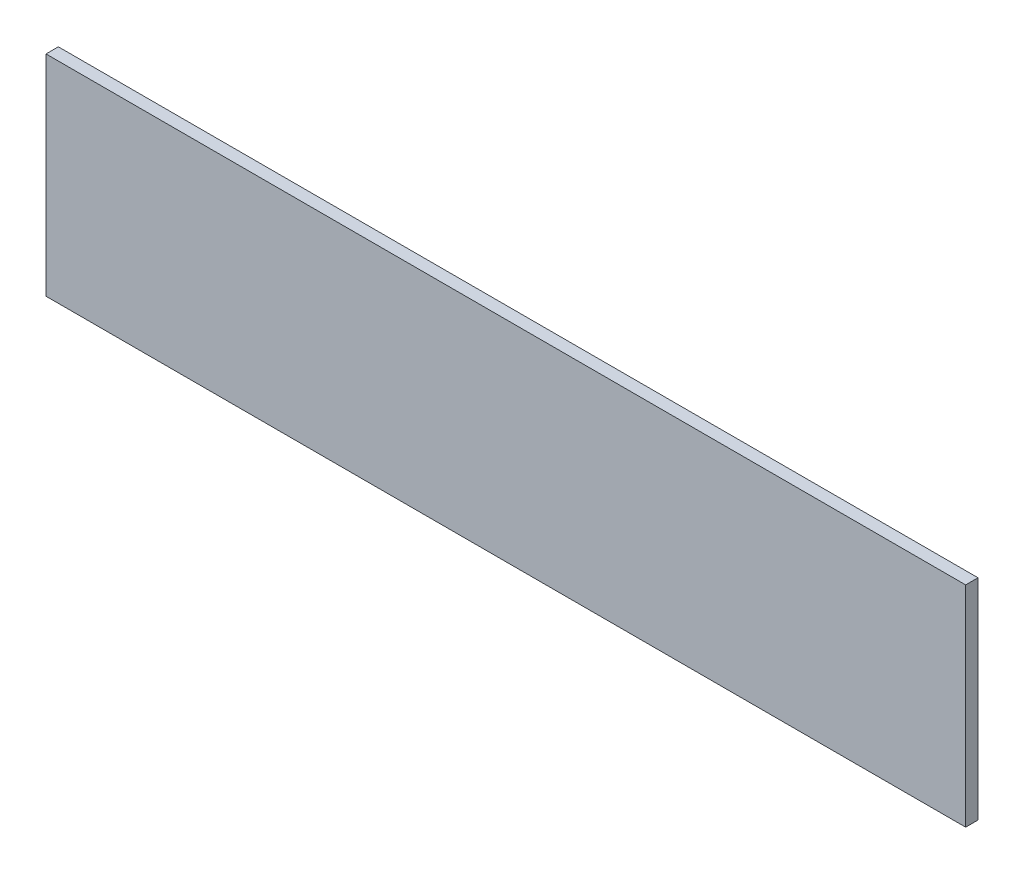
ISO-10303-21;
HEADER;
FILE_DESCRIPTION(('STEP AP214'),'2;1');
FILE_NAME('part.step','',(''),(''),'','','');
FILE_SCHEMA(('AUTOMOTIVE_DESIGN { 1 0 10303 214 1 1 1 1 }'));
ENDSEC;
DATA;
#1=APPLICATION_CONTEXT('core data for automotive mechanical design processes');
#2=APPLICATION_PROTOCOL_DEFINITION('international standard','automotive_design',2000,#1);
#3=PRODUCT_CONTEXT('',#1,'mechanical');
#4=PRODUCT('Part','Part','',(#3));
#5=PRODUCT_RELATED_PRODUCT_CATEGORY('part','',(#4));
#6=PRODUCT_DEFINITION_FORMATION('','',#4);
#7=PRODUCT_DEFINITION_CONTEXT('part definition',#1,'design');
#8=PRODUCT_DEFINITION('design','',#6,#7);
#9=PRODUCT_DEFINITION_SHAPE('','',#8);
#10=(LENGTH_UNIT() NAMED_UNIT(*) SI_UNIT(.MILLI.,.METRE.));
#11=(NAMED_UNIT(*) PLANE_ANGLE_UNIT() SI_UNIT($,.RADIAN.));
#12=(NAMED_UNIT(*) SI_UNIT($,.STERADIAN.) SOLID_ANGLE_UNIT());
#13=UNCERTAINTY_MEASURE_WITH_UNIT(LENGTH_MEASURE(1.E-05),#10,'distance_accuracy_value','');
#14=(GEOMETRIC_REPRESENTATION_CONTEXT(3) GLOBAL_UNCERTAINTY_ASSIGNED_CONTEXT((#13)) GLOBAL_UNIT_ASSIGNED_CONTEXT((#10,
#11,#12)) REPRESENTATION_CONTEXT('',''));
#15=CARTESIAN_POINT('',(0.,0.,0.));
#16=DIRECTION('',(0.,0.,1.));
#17=DIRECTION('',(1.,0.,0.));
#18=AXIS2_PLACEMENT_3D('',#15,#16,#17);
#19=CARTESIAN_POINT('',(74.5,-17.,2.));
#20=DIRECTION('',(-1.,0.,0.));
#21=DIRECTION('',(0.,0.,1.));
#22=AXIS2_PLACEMENT_3D('',#19,#20,#21);
#23=PLANE('',#22);
#24=DIRECTION('',(0.,1.,0.));
#25=VECTOR('',#24,1.);
#26=CARTESIAN_POINT('',(74.5,-17.,0.));
#27=LINE('',#26,#25);
#28=CARTESIAN_POINT('',(74.5,-17.,0.));
#29=VERTEX_POINT('',#28);
#30=CARTESIAN_POINT('',(74.5,17.,0.));
#31=VERTEX_POINT('',#30);
#32=EDGE_CURVE('E96',#29,#31,#27,.T.);
#33=ORIENTED_EDGE('',*,*,#32,.T.);
#34=DIRECTION('',(0.,0.,-1.));
#35=VECTOR('',#34,1.);
#36=CARTESIAN_POINT('',(74.5,17.,2.));
#37=LINE('',#36,#35);
#38=CARTESIAN_POINT('',(74.5,17.,2.));
#39=VERTEX_POINT('',#38);
#40=EDGE_CURVE('E11',#39,#31,#37,.T.);
#41=ORIENTED_EDGE('',*,*,#40,.F.);
#42=DIRECTION('',(0.,1.,0.));
#43=VECTOR('',#42,1.);
#44=CARTESIAN_POINT('',(74.5,-17.,2.));
#45=LINE('',#44,#43);
#46=CARTESIAN_POINT('',(74.5,-17.,2.));
#47=VERTEX_POINT('',#46);
#48=EDGE_CURVE('E84',#47,#39,#45,.T.);
#49=ORIENTED_EDGE('',*,*,#48,.F.);
#50=DIRECTION('',(0.,0.,-1.));
#51=VECTOR('',#50,1.);
#52=CARTESIAN_POINT('',(74.5,-17.,2.));
#53=LINE('',#52,#51);
#54=EDGE_CURVE('E92',#47,#29,#53,.T.);
#55=ORIENTED_EDGE('',*,*,#54,.T.);
#56=EDGE_LOOP('',(#33,#41,#49,#55));
#57=FACE_BOUND('',#56,.T.);
#58=ADVANCED_FACE('F33',(#57),#23,.F.);
#59=CARTESIAN_POINT('',(-74.5,17.,2.));
#60=DIRECTION('',(0.,-1.,0.));
#61=DIRECTION('',(0.,0.,-1.));
#62=AXIS2_PLACEMENT_3D('',#59,#60,#61);
#63=PLANE('',#62);
#64=DIRECTION('',(-1.,0.,0.));
#65=VECTOR('',#64,1.);
#66=CARTESIAN_POINT('',(-74.5,17.,0.));
#67=LINE('',#66,#65);
#68=CARTESIAN_POINT('',(-74.5,17.,0.));
#69=VERTEX_POINT('',#68);
#70=EDGE_CURVE('E88',#31,#69,#67,.T.);
#71=ORIENTED_EDGE('',*,*,#70,.T.);
#72=DIRECTION('',(0.,0.,-1.));
#73=VECTOR('',#72,1.);
#74=CARTESIAN_POINT('',(-74.5,17.,2.));
#75=LINE('',#74,#73);
#76=CARTESIAN_POINT('',(-74.5,17.,2.));
#77=VERTEX_POINT('',#76);
#78=EDGE_CURVE('E41',#77,#69,#75,.T.);
#79=ORIENTED_EDGE('',*,*,#78,.F.);
#80=DIRECTION('',(-1.,0.,0.));
#81=VECTOR('',#80,1.);
#82=CARTESIAN_POINT('',(-74.5,17.,2.));
#83=LINE('',#82,#81);
#84=EDGE_CURVE('E79',#39,#77,#83,.T.);
#85=ORIENTED_EDGE('',*,*,#84,.F.);
#86=ORIENTED_EDGE('',*,*,#40,.T.);
#87=EDGE_LOOP('',(#71,#79,#85,#86));
#88=FACE_BOUND('',#87,.T.);
#89=ADVANCED_FACE('F87',(#88),#63,.F.);
#90=CARTESIAN_POINT('',(-74.5,-17.,2.));
#91=DIRECTION('',(1.,0.,0.));
#92=DIRECTION('',(0.,0.,-1.));
#93=AXIS2_PLACEMENT_3D('',#90,#91,#92);
#94=PLANE('',#93);
#95=DIRECTION('',(0.,-1.,0.));
#96=VECTOR('',#95,1.);
#97=CARTESIAN_POINT('',(-74.5,-17.,0.));
#98=LINE('',#97,#96);
#99=CARTESIAN_POINT('',(-74.5,-17.,0.));
#100=VERTEX_POINT('',#99);
#101=EDGE_CURVE('E66',#69,#100,#98,.T.);
#102=ORIENTED_EDGE('',*,*,#101,.T.);
#103=DIRECTION('',(0.,0.,-1.));
#104=VECTOR('',#103,1.);
#105=CARTESIAN_POINT('',(-74.5,-17.,2.));
#106=LINE('',#105,#104);
#107=CARTESIAN_POINT('',(-74.5,-17.,2.));
#108=VERTEX_POINT('',#107);
#109=EDGE_CURVE('E89',#108,#100,#106,.T.);
#110=ORIENTED_EDGE('',*,*,#109,.F.);
#111=DIRECTION('',(0.,-1.,0.));
#112=VECTOR('',#111,1.);
#113=CARTESIAN_POINT('',(-74.5,-17.,2.));
#114=LINE('',#113,#112);
#115=EDGE_CURVE('E82',#77,#108,#114,.T.);
#116=ORIENTED_EDGE('',*,*,#115,.F.);
#117=ORIENTED_EDGE('',*,*,#78,.T.);
#118=EDGE_LOOP('',(#102,#110,#116,#117));
#119=FACE_BOUND('',#118,.T.);
#120=ADVANCED_FACE('F90',(#119),#94,.F.);
#121=CARTESIAN_POINT('',(-74.5,-17.,2.));
#122=DIRECTION('',(0.,1.,0.));
#123=DIRECTION('',(0.,0.,1.));
#124=AXIS2_PLACEMENT_3D('',#121,#122,#123);
#125=PLANE('',#124);
#126=DIRECTION('',(1.,0.,0.));
#127=VECTOR('',#126,1.);
#128=CARTESIAN_POINT('',(-74.5,-17.,0.));
#129=LINE('',#128,#127);
#130=EDGE_CURVE('E72',#100,#29,#129,.T.);
#131=ORIENTED_EDGE('',*,*,#130,.T.);
#132=ORIENTED_EDGE('',*,*,#54,.F.);
#133=DIRECTION('',(1.,0.,0.));
#134=VECTOR('',#133,1.);
#135=CARTESIAN_POINT('',(-74.5,-17.,2.));
#136=LINE('',#135,#134);
#137=EDGE_CURVE('E49',#108,#47,#136,.T.);
#138=ORIENTED_EDGE('',*,*,#137,.F.);
#139=ORIENTED_EDGE('',*,*,#109,.T.);
#140=EDGE_LOOP('',(#131,#132,#138,#139));
#141=FACE_BOUND('',#140,.T.);
#142=ADVANCED_FACE('F103',(#141),#125,.F.);
#143=CARTESIAN_POINT('',(0.,0.,2.));
#144=DIRECTION('',(0.,0.,-1.));
#145=DIRECTION('',(-1.,0.,0.));
#146=AXIS2_PLACEMENT_3D('',#143,#144,#145);
#147=PLANE('',#146);
#148=ORIENTED_EDGE('',*,*,#48,.T.);
#149=ORIENTED_EDGE('',*,*,#84,.T.);
#150=ORIENTED_EDGE('',*,*,#115,.T.);
#151=ORIENTED_EDGE('',*,*,#137,.T.);
#152=EDGE_LOOP('',(#148,#149,#150,#151));
#153=FACE_BOUND('',#152,.T.);
#154=ADVANCED_FACE('F80',(#153),#147,.F.);
#155=CARTESIAN_POINT('',(0.,0.,0.));
#156=DIRECTION('',(0.,0.,-1.));
#157=DIRECTION('',(-1.,0.,0.));
#158=AXIS2_PLACEMENT_3D('',#155,#156,#157);
#159=PLANE('',#158);
#160=ORIENTED_EDGE('',*,*,#32,.F.);
#161=ORIENTED_EDGE('',*,*,#130,.F.);
#162=ORIENTED_EDGE('',*,*,#101,.F.);
#163=ORIENTED_EDGE('',*,*,#70,.F.);
#164=EDGE_LOOP('',(#160,#161,#162,#163));
#165=FACE_BOUND('',#164,.T.);
#166=ADVANCED_FACE('F106',(#165),#159,.T.);
#167=CLOSED_SHELL('',(#58,#89,#120,#142,#154,#166));
#168=MANIFOLD_SOLID_BREP('B2',#167);
#169=ADVANCED_BREP_SHAPE_REPRESENTATION('',(#18,#168),#14);
#170=SHAPE_DEFINITION_REPRESENTATION(#9,#169);
ENDSEC;
END-ISO-10303-21;
